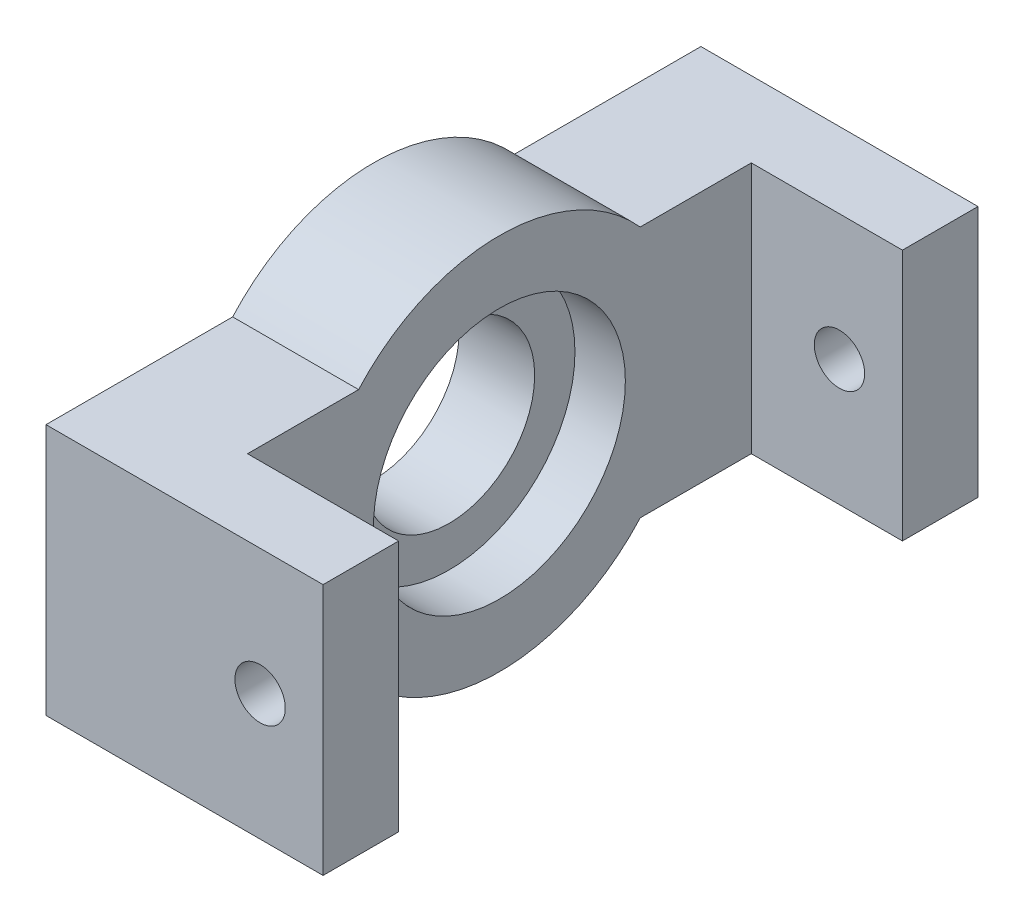
ISO-10303-21;
HEADER;
FILE_DESCRIPTION(('STEP AP214'),'2;1');
FILE_NAME('part.step','',(''),(''),'','','');
FILE_SCHEMA(('AUTOMOTIVE_DESIGN { 1 0 10303 214 1 1 1 1 }'));
ENDSEC;
DATA;
#1=APPLICATION_CONTEXT('core data for automotive mechanical design processes');
#2=APPLICATION_PROTOCOL_DEFINITION('international standard','automotive_design',2000,#1);
#3=PRODUCT_CONTEXT('',#1,'mechanical');
#4=PRODUCT('Part','Part','',(#3));
#5=PRODUCT_RELATED_PRODUCT_CATEGORY('part','',(#4));
#6=PRODUCT_DEFINITION_FORMATION('','',#4);
#7=PRODUCT_DEFINITION_CONTEXT('part definition',#1,'design');
#8=PRODUCT_DEFINITION('design','',#6,#7);
#9=PRODUCT_DEFINITION_SHAPE('','',#8);
#10=(LENGTH_UNIT() NAMED_UNIT(*) SI_UNIT(.MILLI.,.METRE.));
#11=(NAMED_UNIT(*) PLANE_ANGLE_UNIT() SI_UNIT($,.RADIAN.));
#12=(NAMED_UNIT(*) SI_UNIT($,.STERADIAN.) SOLID_ANGLE_UNIT());
#13=UNCERTAINTY_MEASURE_WITH_UNIT(LENGTH_MEASURE(1.E-05),#10,'distance_accuracy_value','');
#14=(GEOMETRIC_REPRESENTATION_CONTEXT(3) GLOBAL_UNCERTAINTY_ASSIGNED_CONTEXT((#13)) GLOBAL_UNIT_ASSIGNED_CONTEXT((#10,
#11,#12)) REPRESENTATION_CONTEXT('',''));
#15=CARTESIAN_POINT('',(0.,0.,0.));
#16=DIRECTION('',(0.,0.,1.));
#17=DIRECTION('',(1.,0.,0.));
#18=AXIS2_PLACEMENT_3D('',#15,#16,#17);
#19=CARTESIAN_POINT('',(5.,0.,0.));
#20=DIRECTION('',(1.,0.,0.));
#21=DIRECTION('',(0.,0.,-1.));
#22=AXIS2_PLACEMENT_3D('',#19,#20,#21);
#23=PLANE('',#22);
#24=CARTESIAN_POINT('',(5.,0.,0.));
#25=DIRECTION('',(1.,0.,0.));
#26=DIRECTION('',(0.,0.,-1.));
#27=AXIS2_PLACEMENT_3D('',#24,#25,#26);
#28=CIRCLE('',#27,5.);
#29=CARTESIAN_POINT('',(5.,0.,-5.));
#30=VERTEX_POINT('',#29);
#31=EDGE_CURVE('E222',#30,#30,#28,.T.);
#32=ORIENTED_EDGE('',*,*,#31,.F.);
#33=EDGE_LOOP('',(#32));
#34=FACE_BOUND('',#33,.T.);
#35=DIRECTION('',(0.,0.,1.));
#36=VECTOR('',#35,1.);
#37=CARTESIAN_POINT('',(5.,5.,13.));
#38=LINE('',#37,#36);
#39=CARTESIAN_POINT('',(5.,5.,5.59016994374948));
#40=VERTEX_POINT('',#39);
#41=CARTESIAN_POINT('',(5.,5.,9.99999999999999));
#42=VERTEX_POINT('',#41);
#43=EDGE_CURVE('E52',#40,#42,#38,.T.);
#44=ORIENTED_EDGE('',*,*,#43,.T.);
#45=DIRECTION('',(0.,1.,0.));
#46=VECTOR('',#45,1.);
#47=CARTESIAN_POINT('',(5.,5.,10.));
#48=LINE('',#47,#46);
#49=CARTESIAN_POINT('',(5.,-5.,9.99999999999999));
#50=VERTEX_POINT('',#49);
#51=EDGE_CURVE('E151',#50,#42,#48,.T.);
#52=ORIENTED_EDGE('',*,*,#51,.F.);
#53=DIRECTION('',(0.,0.,-1.));
#54=VECTOR('',#53,1.);
#55=CARTESIAN_POINT('',(5.,-5.,13.));
#56=LINE('',#55,#54);
#57=CARTESIAN_POINT('',(5.,-5.,5.59016994374948));
#58=VERTEX_POINT('',#57);
#59=EDGE_CURVE('E197',#50,#58,#56,.T.);
#60=ORIENTED_EDGE('',*,*,#59,.T.);
#61=CARTESIAN_POINT('',(5.,0.,0.));
#62=DIRECTION('',(1.,0.,0.));
#63=DIRECTION('',(0.,0.,-1.));
#64=AXIS2_PLACEMENT_3D('',#61,#62,#63);
#65=CIRCLE('',#64,7.5);
#66=CARTESIAN_POINT('',(5.,-5.,-5.59016994374948));
#67=VERTEX_POINT('',#66);
#68=EDGE_CURVE('E11',#58,#67,#65,.T.);
#69=ORIENTED_EDGE('',*,*,#68,.T.);
#70=DIRECTION('',(0.,0.,-1.));
#71=VECTOR('',#70,1.);
#72=CARTESIAN_POINT('',(5.,-5.,-5.59016994374948));
#73=LINE('',#72,#71);
#74=CARTESIAN_POINT('',(5.,-5.,-10.));
#75=VERTEX_POINT('',#74);
#76=EDGE_CURVE('E181',#67,#75,#73,.T.);
#77=ORIENTED_EDGE('',*,*,#76,.T.);
#78=DIRECTION('',(0.,-1.,0.));
#79=VECTOR('',#78,1.);
#80=CARTESIAN_POINT('',(5.,5.,-10.));
#81=LINE('',#80,#79);
#82=CARTESIAN_POINT('',(5.,5.,-10.));
#83=VERTEX_POINT('',#82);
#84=EDGE_CURVE('E59',#83,#75,#81,.T.);
#85=ORIENTED_EDGE('',*,*,#84,.F.);
#86=DIRECTION('',(0.,0.,1.));
#87=VECTOR('',#86,1.);
#88=CARTESIAN_POINT('',(5.,5.,-5.59016994374948));
#89=LINE('',#88,#87);
#90=CARTESIAN_POINT('',(5.,5.,-5.59016994374948));
#91=VERTEX_POINT('',#90);
#92=EDGE_CURVE('E186',#83,#91,#89,.T.);
#93=ORIENTED_EDGE('',*,*,#92,.T.);
#94=EDGE_CURVE('E44',#91,#40,#65,.T.);
#95=ORIENTED_EDGE('',*,*,#94,.T.);
#96=EDGE_LOOP('',(#44,#52,#60,#69,#77,#85,#93,#95));
#97=FACE_BOUND('',#96,.T.);
#98=ADVANCED_FACE('F35',(#34,#97),#23,.T.);
#99=CARTESIAN_POINT('',(5.,0.,0.));
#100=DIRECTION('',(-1.,0.,0.));
#101=DIRECTION('',(0.,0.,1.));
#102=AXIS2_PLACEMENT_3D('',#99,#100,#101);
#103=CYLINDRICAL_SURFACE('',#102,7.5);
#104=CARTESIAN_POINT('',(0.,0.,0.));
#105=DIRECTION('',(1.,0.,0.));
#106=DIRECTION('',(0.,0.,-1.));
#107=AXIS2_PLACEMENT_3D('',#104,#105,#106);
#108=CIRCLE('',#107,7.5);
#109=CARTESIAN_POINT('',(0.,-5.,5.59016994374948));
#110=VERTEX_POINT('',#109);
#111=CARTESIAN_POINT('',(0.,-5.,-5.59016994374948));
#112=VERTEX_POINT('',#111);
#113=EDGE_CURVE('E230',#110,#112,#108,.T.);
#114=ORIENTED_EDGE('',*,*,#113,.T.);
#115=DIRECTION('',(1.,0.,0.));
#116=VECTOR('',#115,1.);
#117=CARTESIAN_POINT('',(0.,-5.,-5.59016994374948));
#118=LINE('',#117,#116);
#119=EDGE_CURVE('E194',#112,#67,#118,.T.);
#120=ORIENTED_EDGE('',*,*,#119,.T.);
#121=ORIENTED_EDGE('',*,*,#68,.F.);
#122=DIRECTION('',(1.,0.,0.));
#123=VECTOR('',#122,1.);
#124=CARTESIAN_POINT('',(0.,-5.,5.59016994374948));
#125=LINE('',#124,#123);
#126=EDGE_CURVE('E135',#110,#58,#125,.T.);
#127=ORIENTED_EDGE('',*,*,#126,.F.);
#128=EDGE_LOOP('',(#114,#120,#121,#127));
#129=FACE_BOUND('',#128,.T.);
#130=ADVANCED_FACE('F248',(#129),#103,.T.);
#131=ORIENTED_EDGE('',*,*,#94,.F.);
#132=DIRECTION('',(1.,0.,0.));
#133=VECTOR('',#132,1.);
#134=CARTESIAN_POINT('',(0.,5.,-5.59016994374948));
#135=LINE('',#134,#133);
#136=CARTESIAN_POINT('',(0.,5.,-5.59016994374948));
#137=VERTEX_POINT('',#136);
#138=EDGE_CURVE('E198',#137,#91,#135,.T.);
#139=ORIENTED_EDGE('',*,*,#138,.F.);
#140=CARTESIAN_POINT('',(0.,5.,5.59016994374948));
#141=VERTEX_POINT('',#140);
#142=EDGE_CURVE('E228',#137,#141,#108,.T.);
#143=ORIENTED_EDGE('',*,*,#142,.T.);
#144=DIRECTION('',(1.,0.,0.));
#145=VECTOR('',#144,1.);
#146=CARTESIAN_POINT('',(0.,5.,5.59016994374948));
#147=LINE('',#146,#145);
#148=EDGE_CURVE('E214',#141,#40,#147,.T.);
#149=ORIENTED_EDGE('',*,*,#148,.T.);
#150=EDGE_LOOP('',(#131,#139,#143,#149));
#151=FACE_BOUND('',#150,.T.);
#152=ADVANCED_FACE('F37',(#151),#103,.T.);
#153=CARTESIAN_POINT('',(0.,0.,0.));
#154=DIRECTION('',(1.,0.,0.));
#155=DIRECTION('',(0.,0.,-1.));
#156=AXIS2_PLACEMENT_3D('',#153,#154,#155);
#157=PLANE('',#156);
#158=CARTESIAN_POINT('',(0.,0.,0.));
#159=DIRECTION('',(1.,0.,0.));
#160=DIRECTION('',(0.,0.,-1.));
#161=AXIS2_PLACEMENT_3D('',#158,#159,#160);
#162=CIRCLE('',#161,3.4);
#163=CARTESIAN_POINT('',(0.,0.,-3.4));
#164=VERTEX_POINT('',#163);
#165=EDGE_CURVE('E219',#164,#164,#162,.T.);
#166=ORIENTED_EDGE('',*,*,#165,.T.);
#167=EDGE_LOOP('',(#166));
#168=FACE_BOUND('',#167,.T.);
#169=ORIENTED_EDGE('',*,*,#142,.F.);
#170=DIRECTION('',(0.,0.,1.));
#171=VECTOR('',#170,1.);
#172=CARTESIAN_POINT('',(0.,5.,-5.59016994374948));
#173=LINE('',#172,#171);
#174=CARTESIAN_POINT('',(0.,5.,-13.));
#175=VERTEX_POINT('',#174);
#176=EDGE_CURVE('E189',#175,#137,#173,.T.);
#177=ORIENTED_EDGE('',*,*,#176,.F.);
#178=DIRECTION('',(0.,1.,0.));
#179=VECTOR('',#178,1.);
#180=CARTESIAN_POINT('',(0.,5.,-13.));
#181=LINE('',#180,#179);
#182=CARTESIAN_POINT('',(0.,-5.,-13.));
#183=VERTEX_POINT('',#182);
#184=EDGE_CURVE('E185',#183,#175,#181,.T.);
#185=ORIENTED_EDGE('',*,*,#184,.F.);
#186=DIRECTION('',(0.,0.,-1.));
#187=VECTOR('',#186,1.);
#188=CARTESIAN_POINT('',(0.,-5.,-5.59016994374948));
#189=LINE('',#188,#187);
#190=EDGE_CURVE('E182',#112,#183,#189,.T.);
#191=ORIENTED_EDGE('',*,*,#190,.F.);
#192=ORIENTED_EDGE('',*,*,#113,.F.);
#193=DIRECTION('',(0.,0.,-1.));
#194=VECTOR('',#193,1.);
#195=CARTESIAN_POINT('',(0.,-5.,13.));
#196=LINE('',#195,#194);
#197=CARTESIAN_POINT('',(0.,-5.,13.));
#198=VERTEX_POINT('',#197);
#199=EDGE_CURVE('E205',#198,#110,#196,.T.);
#200=ORIENTED_EDGE('',*,*,#199,.F.);
#201=DIRECTION('',(0.,-1.,0.));
#202=VECTOR('',#201,1.);
#203=CARTESIAN_POINT('',(0.,5.,13.));
#204=LINE('',#203,#202);
#205=CARTESIAN_POINT('',(0.,5.,13.));
#206=VERTEX_POINT('',#205);
#207=EDGE_CURVE('E132',#206,#198,#204,.T.);
#208=ORIENTED_EDGE('',*,*,#207,.F.);
#209=DIRECTION('',(0.,0.,1.));
#210=VECTOR('',#209,1.);
#211=CARTESIAN_POINT('',(0.,5.,13.));
#212=LINE('',#211,#210);
#213=EDGE_CURVE('E136',#141,#206,#212,.T.);
#214=ORIENTED_EDGE('',*,*,#213,.F.);
#215=EDGE_LOOP('',(#169,#177,#185,#191,#192,#200,#208,#214));
#216=FACE_BOUND('',#215,.T.);
#217=ADVANCED_FACE('F245',(#168,#216),#157,.F.);
#218=CARTESIAN_POINT('',(3.,0.,0.));
#219=DIRECTION('',(1.,0.,0.));
#220=DIRECTION('',(0.,0.,-1.));
#221=AXIS2_PLACEMENT_3D('',#218,#219,#220);
#222=CYLINDRICAL_SURFACE('',#221,5.);
#223=CARTESIAN_POINT('',(3.,0.,0.));
#224=DIRECTION('',(1.,0.,0.));
#225=DIRECTION('',(0.,0.,-1.));
#226=AXIS2_PLACEMENT_3D('',#223,#224,#225);
#227=CIRCLE('',#226,5.);
#228=CARTESIAN_POINT('',(3.,0.,-5.));
#229=VERTEX_POINT('',#228);
#230=EDGE_CURVE('E225',#229,#229,#227,.T.);
#231=ORIENTED_EDGE('',*,*,#230,.F.);
#232=EDGE_LOOP('',(#231));
#233=FACE_BOUND('',#232,.T.);
#234=ORIENTED_EDGE('',*,*,#31,.T.);
#235=EDGE_LOOP('',(#234));
#236=FACE_BOUND('',#235,.T.);
#237=ADVANCED_FACE('F274',(#233,#236),#222,.F.);
#238=CARTESIAN_POINT('',(3.,0.,0.));
#239=DIRECTION('',(1.,0.,0.));
#240=DIRECTION('',(0.,0.,-1.));
#241=AXIS2_PLACEMENT_3D('',#238,#239,#240);
#242=PLANE('',#241);
#243=CARTESIAN_POINT('',(3.,0.,0.));
#244=DIRECTION('',(1.,0.,0.));
#245=DIRECTION('',(0.,0.,-1.));
#246=AXIS2_PLACEMENT_3D('',#243,#244,#245);
#247=CIRCLE('',#246,3.4);
#248=CARTESIAN_POINT('',(3.,0.,-3.4));
#249=VERTEX_POINT('',#248);
#250=EDGE_CURVE('E213',#249,#249,#247,.T.);
#251=ORIENTED_EDGE('',*,*,#250,.F.);
#252=EDGE_LOOP('',(#251));
#253=FACE_BOUND('',#252,.T.);
#254=ORIENTED_EDGE('',*,*,#230,.T.);
#255=EDGE_LOOP('',(#254));
#256=FACE_BOUND('',#255,.T.);
#257=ADVANCED_FACE('F282',(#253,#256),#242,.T.);
#258=CARTESIAN_POINT('',(0.,0.,0.));
#259=DIRECTION('',(1.,0.,0.));
#260=DIRECTION('',(0.,0.,-1.));
#261=AXIS2_PLACEMENT_3D('',#258,#259,#260);
#262=CYLINDRICAL_SURFACE('',#261,3.4);
#263=ORIENTED_EDGE('',*,*,#165,.F.);
#264=EDGE_LOOP('',(#263));
#265=FACE_BOUND('',#264,.T.);
#266=ORIENTED_EDGE('',*,*,#250,.T.);
#267=EDGE_LOOP('',(#266));
#268=FACE_BOUND('',#267,.T.);
#269=ADVANCED_FACE('F286',(#265,#268),#262,.F.);
#270=CARTESIAN_POINT('',(0.,5.,13.));
#271=DIRECTION('',(0.,0.,1.));
#272=DIRECTION('',(1.,0.,0.));
#273=AXIS2_PLACEMENT_3D('',#270,#271,#272);
#274=PLANE('',#273);
#275=CARTESIAN_POINT('',(8.5,0.,13.));
#276=DIRECTION('',(0.,0.,-1.));
#277=DIRECTION('',(-1.,0.,0.));
#278=AXIS2_PLACEMENT_3D('',#275,#276,#277);
#279=CIRCLE('',#278,1.);
#280=CARTESIAN_POINT('',(7.5,0.,13.));
#281=VERTEX_POINT('',#280);
#282=EDGE_CURVE('E334',#281,#281,#279,.T.);
#283=ORIENTED_EDGE('',*,*,#282,.T.);
#284=EDGE_LOOP('',(#283));
#285=FACE_BOUND('',#284,.T.);
#286=DIRECTION('',(1.,0.,0.));
#287=VECTOR('',#286,1.);
#288=CARTESIAN_POINT('',(0.,-5.,13.));
#289=LINE('',#288,#287);
#290=CARTESIAN_POINT('',(11.,-5.,13.));
#291=VERTEX_POINT('',#290);
#292=EDGE_CURVE('E126',#198,#291,#289,.T.);
#293=ORIENTED_EDGE('',*,*,#292,.T.);
#294=DIRECTION('',(0.,-1.,0.));
#295=VECTOR('',#294,1.);
#296=CARTESIAN_POINT('',(11.,5.,13.));
#297=LINE('',#296,#295);
#298=CARTESIAN_POINT('',(11.,5.,13.));
#299=VERTEX_POINT('',#298);
#300=EDGE_CURVE('E130',#299,#291,#297,.T.);
#301=ORIENTED_EDGE('',*,*,#300,.F.);
#302=DIRECTION('',(1.,0.,0.));
#303=VECTOR('',#302,1.);
#304=CARTESIAN_POINT('',(0.,5.,13.));
#305=LINE('',#304,#303);
#306=EDGE_CURVE('E211',#206,#299,#305,.T.);
#307=ORIENTED_EDGE('',*,*,#306,.F.);
#308=ORIENTED_EDGE('',*,*,#207,.T.);
#309=EDGE_LOOP('',(#293,#301,#307,#308));
#310=FACE_BOUND('',#309,.T.);
#311=ADVANCED_FACE('F128',(#285,#310),#274,.T.);
#312=CARTESIAN_POINT('',(0.,5.,13.));
#313=DIRECTION('',(0.,1.,0.));
#314=DIRECTION('',(0.,0.,1.));
#315=AXIS2_PLACEMENT_3D('',#312,#313,#314);
#316=PLANE('',#315);
#317=ORIENTED_EDGE('',*,*,#43,.F.);
#318=ORIENTED_EDGE('',*,*,#148,.F.);
#319=ORIENTED_EDGE('',*,*,#213,.T.);
#320=ORIENTED_EDGE('',*,*,#306,.T.);
#321=DIRECTION('',(0.,0.,1.));
#322=VECTOR('',#321,1.);
#323=CARTESIAN_POINT('',(11.,5.,13.));
#324=LINE('',#323,#322);
#325=CARTESIAN_POINT('',(11.,5.,10.));
#326=VERTEX_POINT('',#325);
#327=EDGE_CURVE('E150',#326,#299,#324,.T.);
#328=ORIENTED_EDGE('',*,*,#327,.F.);
#329=DIRECTION('',(-1.,0.,0.));
#330=VECTOR('',#329,1.);
#331=CARTESIAN_POINT('',(11.,5.,10.));
#332=LINE('',#331,#330);
#333=EDGE_CURVE('E159',#326,#42,#332,.T.);
#334=ORIENTED_EDGE('',*,*,#333,.T.);
#335=EDGE_LOOP('',(#317,#318,#319,#320,#328,#334));
#336=FACE_BOUND('',#335,.T.);
#337=ADVANCED_FACE('F244',(#336),#316,.T.);
#338=CARTESIAN_POINT('',(0.,-5.,13.));
#339=DIRECTION('',(0.,-1.,0.));
#340=DIRECTION('',(0.,0.,-1.));
#341=AXIS2_PLACEMENT_3D('',#338,#339,#340);
#342=PLANE('',#341);
#343=ORIENTED_EDGE('',*,*,#59,.F.);
#344=DIRECTION('',(-1.,0.,0.));
#345=VECTOR('',#344,1.);
#346=CARTESIAN_POINT('',(11.,-5.,9.99999999999999));
#347=LINE('',#346,#345);
#348=CARTESIAN_POINT('',(11.,-5.,9.99999999999999));
#349=VERTEX_POINT('',#348);
#350=EDGE_CURVE('E142',#349,#50,#347,.T.);
#351=ORIENTED_EDGE('',*,*,#350,.F.);
#352=DIRECTION('',(0.,0.,-1.));
#353=VECTOR('',#352,1.);
#354=CARTESIAN_POINT('',(11.,-5.,13.));
#355=LINE('',#354,#353);
#356=EDGE_CURVE('E139',#291,#349,#355,.T.);
#357=ORIENTED_EDGE('',*,*,#356,.F.);
#358=ORIENTED_EDGE('',*,*,#292,.F.);
#359=ORIENTED_EDGE('',*,*,#199,.T.);
#360=ORIENTED_EDGE('',*,*,#126,.T.);
#361=EDGE_LOOP('',(#343,#351,#357,#358,#359,#360));
#362=FACE_BOUND('',#361,.T.);
#363=ADVANCED_FACE('F140',(#362),#342,.T.);
#364=CARTESIAN_POINT('',(0.,-5.,-5.59016994374948));
#365=DIRECTION('',(0.,-1.,0.));
#366=DIRECTION('',(0.,0.,-1.));
#367=AXIS2_PLACEMENT_3D('',#364,#365,#366);
#368=PLANE('',#367);
#369=ORIENTED_EDGE('',*,*,#76,.F.);
#370=ORIENTED_EDGE('',*,*,#119,.F.);
#371=ORIENTED_EDGE('',*,*,#190,.T.);
#372=DIRECTION('',(1.,0.,0.));
#373=VECTOR('',#372,1.);
#374=CARTESIAN_POINT('',(0.,-5.,-13.));
#375=LINE('',#374,#373);
#376=CARTESIAN_POINT('',(11.,-5.,-13.));
#377=VERTEX_POINT('',#376);
#378=EDGE_CURVE('E191',#183,#377,#375,.T.);
#379=ORIENTED_EDGE('',*,*,#378,.T.);
#380=DIRECTION('',(0.,0.,-1.));
#381=VECTOR('',#380,1.);
#382=CARTESIAN_POINT('',(11.,-5.,-13.));
#383=LINE('',#382,#381);
#384=CARTESIAN_POINT('',(11.,-5.,-10.));
#385=VERTEX_POINT('',#384);
#386=EDGE_CURVE('E171',#385,#377,#383,.T.);
#387=ORIENTED_EDGE('',*,*,#386,.F.);
#388=DIRECTION('',(-1.,0.,0.));
#389=VECTOR('',#388,1.);
#390=CARTESIAN_POINT('',(11.,-5.,-10.));
#391=LINE('',#390,#389);
#392=EDGE_CURVE('E174',#385,#75,#391,.T.);
#393=ORIENTED_EDGE('',*,*,#392,.T.);
#394=EDGE_LOOP('',(#369,#370,#371,#379,#387,#393));
#395=FACE_BOUND('',#394,.T.);
#396=ADVANCED_FACE('F304',(#395),#368,.T.);
#397=CARTESIAN_POINT('',(0.,5.,-5.59016994374948));
#398=DIRECTION('',(0.,1.,0.));
#399=DIRECTION('',(0.,0.,1.));
#400=AXIS2_PLACEMENT_3D('',#397,#398,#399);
#401=PLANE('',#400);
#402=ORIENTED_EDGE('',*,*,#92,.F.);
#403=DIRECTION('',(-1.,0.,0.));
#404=VECTOR('',#403,1.);
#405=CARTESIAN_POINT('',(11.,5.,-10.));
#406=LINE('',#405,#404);
#407=CARTESIAN_POINT('',(11.,5.,-10.));
#408=VERTEX_POINT('',#407);
#409=EDGE_CURVE('E178',#408,#83,#406,.T.);
#410=ORIENTED_EDGE('',*,*,#409,.F.);
#411=DIRECTION('',(0.,0.,1.));
#412=VECTOR('',#411,1.);
#413=CARTESIAN_POINT('',(11.,5.,-13.));
#414=LINE('',#413,#412);
#415=CARTESIAN_POINT('',(11.,5.,-13.));
#416=VERTEX_POINT('',#415);
#417=EDGE_CURVE('E167',#416,#408,#414,.T.);
#418=ORIENTED_EDGE('',*,*,#417,.F.);
#419=DIRECTION('',(1.,0.,0.));
#420=VECTOR('',#419,1.);
#421=CARTESIAN_POINT('',(0.,5.,-13.));
#422=LINE('',#421,#420);
#423=EDGE_CURVE('E201',#175,#416,#422,.T.);
#424=ORIENTED_EDGE('',*,*,#423,.F.);
#425=ORIENTED_EDGE('',*,*,#176,.T.);
#426=ORIENTED_EDGE('',*,*,#138,.T.);
#427=EDGE_LOOP('',(#402,#410,#418,#424,#425,#426));
#428=FACE_BOUND('',#427,.T.);
#429=ADVANCED_FACE('F309',(#428),#401,.T.);
#430=CARTESIAN_POINT('',(0.,5.,-13.));
#431=DIRECTION('',(0.,0.,-1.));
#432=DIRECTION('',(0.,1.,0.));
#433=AXIS2_PLACEMENT_3D('',#430,#431,#432);
#434=PLANE('',#433);
#435=CARTESIAN_POINT('',(8.5,0.,-13.));
#436=DIRECTION('',(0.,0.,-1.));
#437=DIRECTION('',(-1.,0.,0.));
#438=AXIS2_PLACEMENT_3D('',#435,#436,#437);
#439=CIRCLE('',#438,1.);
#440=CARTESIAN_POINT('',(7.5,0.,-13.));
#441=VERTEX_POINT('',#440);
#442=EDGE_CURVE('E337',#441,#441,#439,.T.);
#443=ORIENTED_EDGE('',*,*,#442,.F.);
#444=EDGE_LOOP('',(#443));
#445=FACE_BOUND('',#444,.T.);
#446=ORIENTED_EDGE('',*,*,#423,.T.);
#447=DIRECTION('',(0.,1.,0.));
#448=VECTOR('',#447,1.);
#449=CARTESIAN_POINT('',(11.,5.,-13.));
#450=LINE('',#449,#448);
#451=EDGE_CURVE('E164',#377,#416,#450,.T.);
#452=ORIENTED_EDGE('',*,*,#451,.F.);
#453=ORIENTED_EDGE('',*,*,#378,.F.);
#454=ORIENTED_EDGE('',*,*,#184,.T.);
#455=EDGE_LOOP('',(#446,#452,#453,#454));
#456=FACE_BOUND('',#455,.T.);
#457=ADVANCED_FACE('F311',(#445,#456),#434,.T.);
#458=CARTESIAN_POINT('',(11.,5.,-10.));
#459=DIRECTION('',(0.,0.,-1.));
#460=DIRECTION('',(-1.,0.,0.));
#461=AXIS2_PLACEMENT_3D('',#458,#459,#460);
#462=PLANE('',#461);
#463=CARTESIAN_POINT('',(8.5,0.,-10.));
#464=DIRECTION('',(0.,0.,-1.));
#465=DIRECTION('',(-1.,0.,0.));
#466=AXIS2_PLACEMENT_3D('',#463,#464,#465);
#467=CIRCLE('',#466,1.);
#468=CARTESIAN_POINT('',(7.5,0.,-10.));
#469=VERTEX_POINT('',#468);
#470=EDGE_CURVE('E153',#469,#469,#467,.T.);
#471=ORIENTED_EDGE('',*,*,#470,.T.);
#472=EDGE_LOOP('',(#471));
#473=FACE_BOUND('',#472,.T.);
#474=ORIENTED_EDGE('',*,*,#84,.T.);
#475=ORIENTED_EDGE('',*,*,#392,.F.);
#476=DIRECTION('',(0.,-1.,0.));
#477=VECTOR('',#476,1.);
#478=CARTESIAN_POINT('',(11.,5.,-10.));
#479=LINE('',#478,#477);
#480=EDGE_CURVE('E169',#408,#385,#479,.T.);
#481=ORIENTED_EDGE('',*,*,#480,.F.);
#482=ORIENTED_EDGE('',*,*,#409,.T.);
#483=EDGE_LOOP('',(#474,#475,#481,#482));
#484=FACE_BOUND('',#483,.T.);
#485=ADVANCED_FACE('F262',(#473,#484),#462,.F.);
#486=CARTESIAN_POINT('',(11.,0.,0.));
#487=DIRECTION('',(-1.,0.,0.));
#488=DIRECTION('',(0.,0.,1.));
#489=AXIS2_PLACEMENT_3D('',#486,#487,#488);
#490=PLANE('',#489);
#491=ORIENTED_EDGE('',*,*,#451,.T.);
#492=ORIENTED_EDGE('',*,*,#417,.T.);
#493=ORIENTED_EDGE('',*,*,#480,.T.);
#494=ORIENTED_EDGE('',*,*,#386,.T.);
#495=EDGE_LOOP('',(#491,#492,#493,#494));
#496=FACE_BOUND('',#495,.T.);
#497=ADVANCED_FACE('F253',(#496),#490,.F.);
#498=CARTESIAN_POINT('',(11.,5.,10.));
#499=DIRECTION('',(0.,0.,1.));
#500=DIRECTION('',(0.,-1.,0.));
#501=AXIS2_PLACEMENT_3D('',#498,#499,#500);
#502=PLANE('',#501);
#503=CARTESIAN_POINT('',(8.5,0.,9.99999999999999));
#504=DIRECTION('',(0.,0.,1.));
#505=DIRECTION('',(0.,-1.,0.));
#506=AXIS2_PLACEMENT_3D('',#503,#504,#505);
#507=CIRCLE('',#506,1.);
#508=CARTESIAN_POINT('',(8.5,-0.999999999999995,9.99999999999999));
#509=VERTEX_POINT('',#508);
#510=EDGE_CURVE('E39',#509,#509,#507,.T.);
#511=ORIENTED_EDGE('',*,*,#510,.T.);
#512=EDGE_LOOP('',(#511));
#513=FACE_BOUND('',#512,.T.);
#514=ORIENTED_EDGE('',*,*,#51,.T.);
#515=ORIENTED_EDGE('',*,*,#333,.F.);
#516=DIRECTION('',(0.,1.,0.));
#517=VECTOR('',#516,1.);
#518=CARTESIAN_POINT('',(11.,5.,10.));
#519=LINE('',#518,#517);
#520=EDGE_CURVE('E145',#349,#326,#519,.T.);
#521=ORIENTED_EDGE('',*,*,#520,.F.);
#522=ORIENTED_EDGE('',*,*,#350,.T.);
#523=EDGE_LOOP('',(#514,#515,#521,#522));
#524=FACE_BOUND('',#523,.T.);
#525=ADVANCED_FACE('F251',(#513,#524),#502,.F.);
#526=CARTESIAN_POINT('',(11.,0.,0.));
#527=DIRECTION('',(1.,0.,0.));
#528=DIRECTION('',(0.,0.,-1.));
#529=AXIS2_PLACEMENT_3D('',#526,#527,#528);
#530=PLANE('',#529);
#531=ORIENTED_EDGE('',*,*,#300,.T.);
#532=ORIENTED_EDGE('',*,*,#356,.T.);
#533=ORIENTED_EDGE('',*,*,#520,.T.);
#534=ORIENTED_EDGE('',*,*,#327,.T.);
#535=EDGE_LOOP('',(#531,#532,#533,#534));
#536=FACE_BOUND('',#535,.T.);
#537=ADVANCED_FACE('F148',(#536),#530,.T.);
#538=CARTESIAN_POINT('',(8.5,0.,13.));
#539=DIRECTION('',(0.,0.,-1.));
#540=DIRECTION('',(-1.,0.,0.));
#541=AXIS2_PLACEMENT_3D('',#538,#539,#540);
#542=CYLINDRICAL_SURFACE('',#541,1.);
#543=ORIENTED_EDGE('',*,*,#282,.F.);
#544=EDGE_LOOP('',(#543));
#545=FACE_BOUND('',#544,.T.);
#546=ORIENTED_EDGE('',*,*,#510,.F.);
#547=EDGE_LOOP('',(#546));
#548=FACE_BOUND('',#547,.T.);
#549=ADVANCED_FACE('F260',(#545,#548),#542,.F.);
#550=ORIENTED_EDGE('',*,*,#442,.T.);
#551=EDGE_LOOP('',(#550));
#552=FACE_BOUND('',#551,.T.);
#553=ORIENTED_EDGE('',*,*,#470,.F.);
#554=EDGE_LOOP('',(#553));
#555=FACE_BOUND('',#554,.T.);
#556=ADVANCED_FACE('F343',(#552,#555),#542,.F.);
#557=CLOSED_SHELL('',(#98,#130,#152,#217,#237,#257,#269,#311,#337,#363,#396,#429,#457,#485,#497,
#525,#537,#549,#556));
#558=MANIFOLD_SOLID_BREP('B2',#557);
#559=ADVANCED_BREP_SHAPE_REPRESENTATION('',(#18,#558),#14);
#560=SHAPE_DEFINITION_REPRESENTATION(#9,#559);
ENDSEC;
END-ISO-10303-21;
